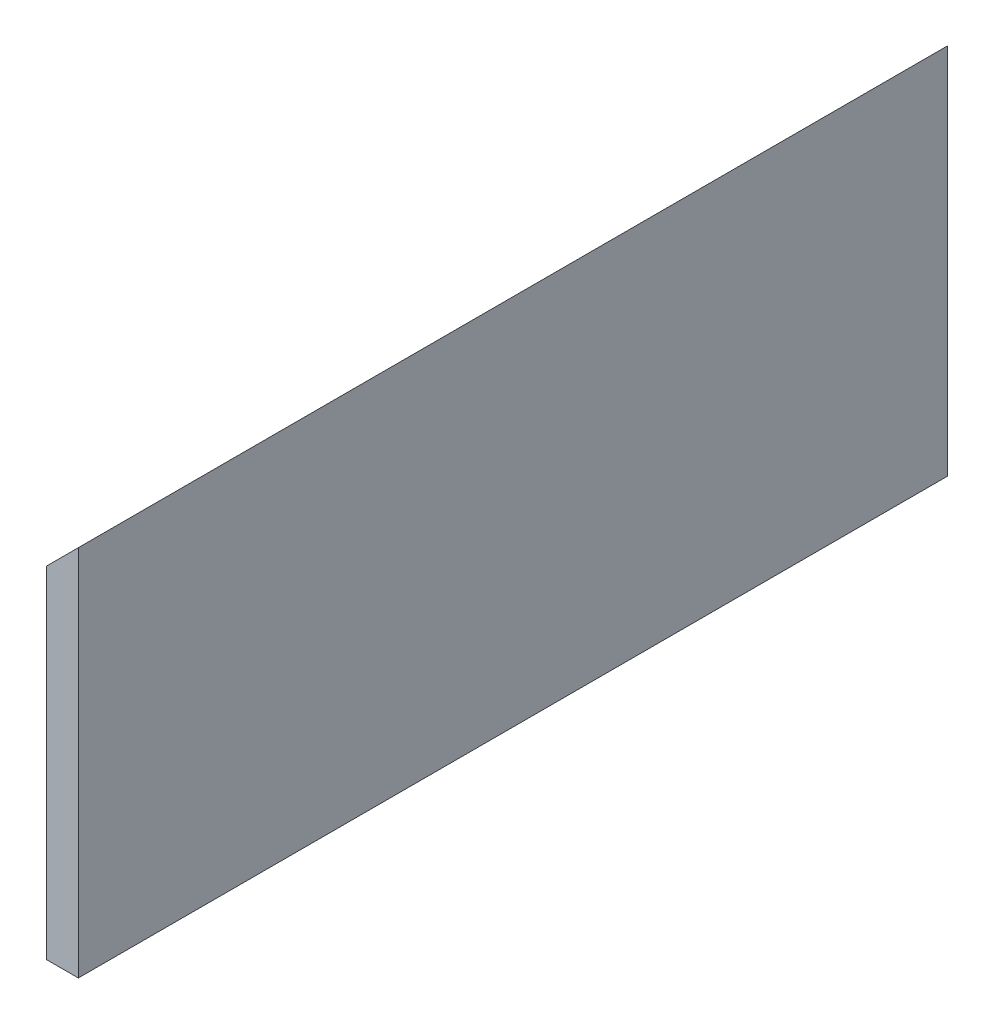
ISO-10303-21;
HEADER;
FILE_DESCRIPTION(('STEP AP214'),'2;1');
FILE_NAME('part.step','',(''),(''),'','','');
FILE_SCHEMA(('AUTOMOTIVE_DESIGN { 1 0 10303 214 1 1 1 1 }'));
ENDSEC;
DATA;
#1=APPLICATION_CONTEXT('core data for automotive mechanical design processes');
#2=APPLICATION_PROTOCOL_DEFINITION('international standard','automotive_design',2000,#1);
#3=PRODUCT_CONTEXT('',#1,'mechanical');
#4=PRODUCT('Part','Part','',(#3));
#5=PRODUCT_RELATED_PRODUCT_CATEGORY('part','',(#4));
#6=PRODUCT_DEFINITION_FORMATION('','',#4);
#7=PRODUCT_DEFINITION_CONTEXT('part definition',#1,'design');
#8=PRODUCT_DEFINITION('design','',#6,#7);
#9=PRODUCT_DEFINITION_SHAPE('','',#8);
#10=(LENGTH_UNIT() NAMED_UNIT(*) SI_UNIT(.MILLI.,.METRE.));
#11=(NAMED_UNIT(*) PLANE_ANGLE_UNIT() SI_UNIT($,.RADIAN.));
#12=(NAMED_UNIT(*) SI_UNIT($,.STERADIAN.) SOLID_ANGLE_UNIT());
#13=UNCERTAINTY_MEASURE_WITH_UNIT(LENGTH_MEASURE(1.E-05),#10,'distance_accuracy_value','');
#14=(GEOMETRIC_REPRESENTATION_CONTEXT(3) GLOBAL_UNCERTAINTY_ASSIGNED_CONTEXT((#13)) GLOBAL_UNIT_ASSIGNED_CONTEXT((#10,
#11,#12)) REPRESENTATION_CONTEXT('',''));
#15=CARTESIAN_POINT('',(0.,0.,0.));
#16=DIRECTION('',(0.,0.,1.));
#17=DIRECTION('',(1.,0.,0.));
#18=AXIS2_PLACEMENT_3D('',#15,#16,#17);
#19=CARTESIAN_POINT('',(10.,0.,-275.));
#20=DIRECTION('',(0.,1.,0.));
#21=DIRECTION('',(0.,0.,1.));
#22=AXIS2_PLACEMENT_3D('',#19,#20,#21);
#23=PLANE('',#22);
#24=DIRECTION('',(0.,0.,-1.));
#25=VECTOR('',#24,1.);
#26=CARTESIAN_POINT('',(0.,0.,-275.));
#27=LINE('',#26,#25);
#28=CARTESIAN_POINT('',(0.,0.,0.));
#29=VERTEX_POINT('',#28);
#30=CARTESIAN_POINT('',(0.,0.,-275.));
#31=VERTEX_POINT('',#30);
#32=EDGE_CURVE('E90',#29,#31,#27,.T.);
#33=ORIENTED_EDGE('',*,*,#32,.T.);
#34=DIRECTION('',(-1.,0.,0.));
#35=VECTOR('',#34,1.);
#36=CARTESIAN_POINT('',(10.,0.,-275.));
#37=LINE('',#36,#35);
#38=CARTESIAN_POINT('',(10.,0.,-275.));
#39=VERTEX_POINT('',#38);
#40=EDGE_CURVE('E11',#39,#31,#37,.T.);
#41=ORIENTED_EDGE('',*,*,#40,.F.);
#42=DIRECTION('',(0.,0.,-1.));
#43=VECTOR('',#42,1.);
#44=CARTESIAN_POINT('',(10.,0.,-275.));
#45=LINE('',#44,#43);
#46=CARTESIAN_POINT('',(10.,0.,0.));
#47=VERTEX_POINT('',#46);
#48=EDGE_CURVE('E84',#47,#39,#45,.T.);
#49=ORIENTED_EDGE('',*,*,#48,.F.);
#50=DIRECTION('',(-1.,0.,0.));
#51=VECTOR('',#50,1.);
#52=CARTESIAN_POINT('',(10.,0.,0.));
#53=LINE('',#52,#51);
#54=EDGE_CURVE('E46',#47,#29,#53,.T.);
#55=ORIENTED_EDGE('',*,*,#54,.T.);
#56=EDGE_LOOP('',(#33,#41,#49,#55));
#57=FACE_BOUND('',#56,.T.);
#58=ADVANCED_FACE('F39',(#57),#23,.F.);
#59=CARTESIAN_POINT('',(10.,117.95,-275.));
#60=DIRECTION('',(0.,0.,1.));
#61=DIRECTION('',(1.,0.,0.));
#62=AXIS2_PLACEMENT_3D('',#59,#60,#61);
#63=PLANE('',#62);
#64=DIRECTION('',(0.,1.,0.));
#65=VECTOR('',#64,1.);
#66=CARTESIAN_POINT('',(0.,117.95,-275.));
#67=LINE('',#66,#65);
#68=CARTESIAN_POINT('',(0.,107.95,-275.));
#69=VERTEX_POINT('',#68);
#70=EDGE_CURVE('E85',#31,#69,#67,.T.);
#71=ORIENTED_EDGE('',*,*,#70,.T.);
#72=DIRECTION('',(-0.707106781186556,-0.707106781186539,0.));
#73=VECTOR('',#72,1.);
#74=CARTESIAN_POINT('',(10.,117.95,-275.));
#75=LINE('',#74,#73);
#76=CARTESIAN_POINT('',(10.,117.95,-275.));
#77=VERTEX_POINT('',#76);
#78=EDGE_CURVE('E53',#77,#69,#75,.T.);
#79=ORIENTED_EDGE('',*,*,#78,.F.);
#80=DIRECTION('',(0.,1.,0.));
#81=VECTOR('',#80,1.);
#82=CARTESIAN_POINT('',(10.,117.95,-275.));
#83=LINE('',#82,#81);
#84=EDGE_CURVE('E101',#39,#77,#83,.T.);
#85=ORIENTED_EDGE('',*,*,#84,.F.);
#86=ORIENTED_EDGE('',*,*,#40,.T.);
#87=EDGE_LOOP('',(#71,#79,#85,#86));
#88=FACE_BOUND('',#87,.T.);
#89=ADVANCED_FACE('F109',(#88),#63,.F.);
#90=CARTESIAN_POINT('',(10.,0.,0.));
#91=DIRECTION('',(0.,0.,-1.));
#92=DIRECTION('',(-1.,0.,0.));
#93=AXIS2_PLACEMENT_3D('',#90,#91,#92);
#94=PLANE('',#93);
#95=DIRECTION('',(0.,-1.,0.));
#96=VECTOR('',#95,1.);
#97=CARTESIAN_POINT('',(10.,0.,0.));
#98=LINE('',#97,#96);
#99=CARTESIAN_POINT('',(10.,117.95,0.));
#100=VERTEX_POINT('',#99);
#101=EDGE_CURVE('E62',#100,#47,#98,.T.);
#102=ORIENTED_EDGE('',*,*,#101,.F.);
#103=DIRECTION('',(-0.707106781186556,-0.707106781186539,0.));
#104=VECTOR('',#103,1.);
#105=CARTESIAN_POINT('',(10.,117.95,0.));
#106=LINE('',#105,#104);
#107=CARTESIAN_POINT('',(0.,107.95,0.));
#108=VERTEX_POINT('',#107);
#109=EDGE_CURVE('E81',#100,#108,#106,.T.);
#110=ORIENTED_EDGE('',*,*,#109,.T.);
#111=DIRECTION('',(0.,-1.,0.));
#112=VECTOR('',#111,1.);
#113=CARTESIAN_POINT('',(0.,0.,0.));
#114=LINE('',#113,#112);
#115=EDGE_CURVE('E76',#108,#29,#114,.T.);
#116=ORIENTED_EDGE('',*,*,#115,.T.);
#117=ORIENTED_EDGE('',*,*,#54,.F.);
#118=EDGE_LOOP('',(#102,#110,#116,#117));
#119=FACE_BOUND('',#118,.T.);
#120=ADVANCED_FACE('F78',(#119),#94,.F.);
#121=CARTESIAN_POINT('',(10.,0.,0.));
#122=DIRECTION('',(-1.,0.,0.));
#123=DIRECTION('',(0.,0.,1.));
#124=AXIS2_PLACEMENT_3D('',#121,#122,#123);
#125=PLANE('',#124);
#126=ORIENTED_EDGE('',*,*,#48,.T.);
#127=ORIENTED_EDGE('',*,*,#84,.T.);
#128=DIRECTION('',(0.,0.,1.));
#129=VECTOR('',#128,1.);
#130=CARTESIAN_POINT('',(10.,117.95,0.));
#131=LINE('',#130,#129);
#132=EDGE_CURVE('E99',#77,#100,#131,.T.);
#133=ORIENTED_EDGE('',*,*,#132,.T.);
#134=ORIENTED_EDGE('',*,*,#101,.T.);
#135=EDGE_LOOP('',(#126,#127,#133,#134));
#136=FACE_BOUND('',#135,.T.);
#137=ADVANCED_FACE('F106',(#136),#125,.F.);
#138=CARTESIAN_POINT('',(0.,0.,0.));
#139=DIRECTION('',(-1.,0.,0.));
#140=DIRECTION('',(0.,0.,1.));
#141=AXIS2_PLACEMENT_3D('',#138,#139,#140);
#142=PLANE('',#141);
#143=DIRECTION('',(0.,0.,-1.));
#144=VECTOR('',#143,1.);
#145=CARTESIAN_POINT('',(0.,107.95,0.));
#146=LINE('',#145,#144);
#147=EDGE_CURVE('E93',#108,#69,#146,.T.);
#148=ORIENTED_EDGE('',*,*,#147,.T.);
#149=ORIENTED_EDGE('',*,*,#70,.F.);
#150=ORIENTED_EDGE('',*,*,#32,.F.);
#151=ORIENTED_EDGE('',*,*,#115,.F.);
#152=EDGE_LOOP('',(#148,#149,#150,#151));
#153=FACE_BOUND('',#152,.T.);
#154=ADVANCED_FACE('F91',(#153),#142,.T.);
#155=CARTESIAN_POINT('',(10.,117.95,0.));
#156=DIRECTION('',(0.707106781186539,-0.707106781186556,0.));
#157=DIRECTION('',(0.707106781186556,0.707106781186539,0.));
#158=AXIS2_PLACEMENT_3D('',#155,#156,#157);
#159=PLANE('',#158);
#160=ORIENTED_EDGE('',*,*,#78,.T.);
#161=ORIENTED_EDGE('',*,*,#147,.F.);
#162=ORIENTED_EDGE('',*,*,#109,.F.);
#163=ORIENTED_EDGE('',*,*,#132,.F.);
#164=EDGE_LOOP('',(#160,#161,#162,#163));
#165=FACE_BOUND('',#164,.T.);
#166=ADVANCED_FACE('F113',(#165),#159,.F.);
#167=CLOSED_SHELL('',(#58,#89,#120,#137,#154,#166));
#168=MANIFOLD_SOLID_BREP('B2',#167);
#169=ADVANCED_BREP_SHAPE_REPRESENTATION('',(#18,#168),#14);
#170=SHAPE_DEFINITION_REPRESENTATION(#9,#169);
ENDSEC;
END-ISO-10303-21;
